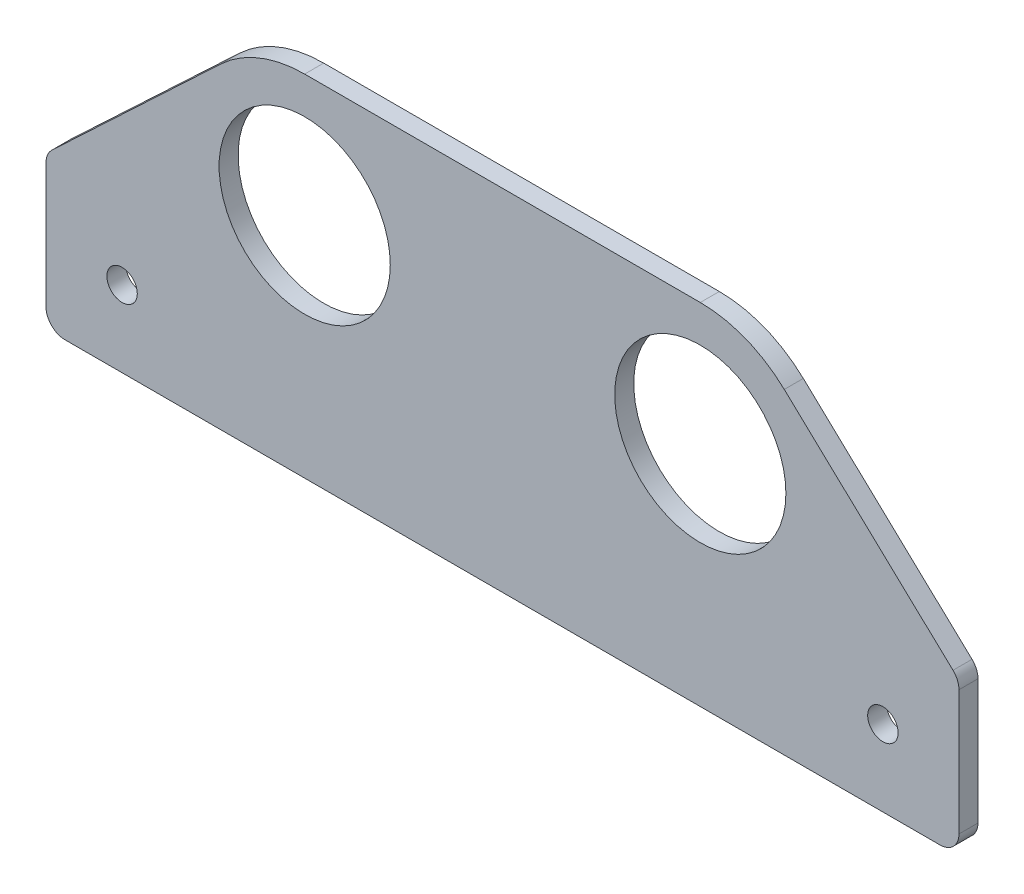
ISO-10303-21;
HEADER;
FILE_DESCRIPTION(('STEP AP214'),'2;1');
FILE_NAME('part.step','',(''),(''),'','','');
FILE_SCHEMA(('AUTOMOTIVE_DESIGN { 1 0 10303 214 1 1 1 1 }'));
ENDSEC;
DATA;
#1=APPLICATION_CONTEXT('core data for automotive mechanical design processes');
#2=APPLICATION_PROTOCOL_DEFINITION('international standard','automotive_design',2000,#1);
#3=PRODUCT_CONTEXT('',#1,'mechanical');
#4=PRODUCT('Part','Part','',(#3));
#5=PRODUCT_RELATED_PRODUCT_CATEGORY('part','',(#4));
#6=PRODUCT_DEFINITION_FORMATION('','',#4);
#7=PRODUCT_DEFINITION_CONTEXT('part definition',#1,'design');
#8=PRODUCT_DEFINITION('design','',#6,#7);
#9=PRODUCT_DEFINITION_SHAPE('','',#8);
#10=(LENGTH_UNIT() NAMED_UNIT(*) SI_UNIT(.MILLI.,.METRE.));
#11=(NAMED_UNIT(*) PLANE_ANGLE_UNIT() SI_UNIT($,.RADIAN.));
#12=(NAMED_UNIT(*) SI_UNIT($,.STERADIAN.) SOLID_ANGLE_UNIT());
#13=UNCERTAINTY_MEASURE_WITH_UNIT(LENGTH_MEASURE(1.E-05),#10,'distance_accuracy_value','');
#14=(GEOMETRIC_REPRESENTATION_CONTEXT(3) GLOBAL_UNCERTAINTY_ASSIGNED_CONTEXT((#13)) GLOBAL_UNIT_ASSIGNED_CONTEXT((#10,
#11,#12)) REPRESENTATION_CONTEXT('',''));
#15=CARTESIAN_POINT('',(0.,0.,0.));
#16=DIRECTION('',(0.,0.,1.));
#17=DIRECTION('',(1.,0.,0.));
#18=AXIS2_PLACEMENT_3D('',#15,#16,#17);
#19=CARTESIAN_POINT('',(43.18,37.973,3.175));
#20=DIRECTION('',(0.,0.,-1.));
#21=DIRECTION('',(-1.,0.,0.));
#22=AXIS2_PLACEMENT_3D('',#19,#20,#21);
#23=PLANE('',#22);
#24=DIRECTION('',(-0.728052653038429,-0.685521213678836,0.));
#25=VECTOR('',#24,1.);
#26=CARTESIAN_POINT('',(0.,25.4,3.175));
#27=LINE('',#26,#25);
#28=CARTESIAN_POINT('',(29.1631477439088,52.8594925966768,3.175));
#29=VERTEX_POINT('',#28);
#30=CARTESIAN_POINT('',(0.998470146569695,26.3401414359827,3.175));
#31=VERTEX_POINT('',#30);
#32=EDGE_CURVE('E155',#29,#31,#27,.T.);
#33=ORIENTED_EDGE('',*,*,#32,.T.);
#34=CARTESIAN_POINT('',(3.175,24.0285742625857,3.175));
#35=DIRECTION('',(0.,0.,-1.));
#36=DIRECTION('',(-1.,0.,0.));
#37=AXIS2_PLACEMENT_3D('',#34,#35,#36);
#38=CIRCLE('',#37,3.175);
#39=CARTESIAN_POINT('',(0.,24.0285742625857,3.175));
#40=VERTEX_POINT('',#39);
#41=EDGE_CURVE('E203',#31,#40,#38,.F.);
#42=ORIENTED_EDGE('',*,*,#41,.T.);
#43=DIRECTION('',(0.,-1.,0.));
#44=VECTOR('',#43,1.);
#45=CARTESIAN_POINT('',(0.,0.,3.175));
#46=LINE('',#45,#44);
#47=CARTESIAN_POINT('',(0.,3.175,3.175));
#48=VERTEX_POINT('',#47);
#49=EDGE_CURVE('E177',#40,#48,#46,.T.);
#50=ORIENTED_EDGE('',*,*,#49,.T.);
#51=CARTESIAN_POINT('',(3.175,3.175,3.175));
#52=DIRECTION('',(0.,0.,-1.));
#53=DIRECTION('',(-1.,0.,0.));
#54=AXIS2_PLACEMENT_3D('',#51,#52,#53);
#55=CIRCLE('',#54,3.175);
#56=CARTESIAN_POINT('',(3.175,0.,3.175));
#57=VERTEX_POINT('',#56);
#58=EDGE_CURVE('E199',#48,#57,#55,.F.);
#59=ORIENTED_EDGE('',*,*,#58,.T.);
#60=DIRECTION('',(1.,0.,0.));
#61=VECTOR('',#60,1.);
#62=CARTESIAN_POINT('',(0.,0.,3.175));
#63=LINE('',#62,#61);
#64=CARTESIAN_POINT('',(149.225,0.,3.175));
#65=VERTEX_POINT('',#64);
#66=EDGE_CURVE('E216',#57,#65,#63,.T.);
#67=ORIENTED_EDGE('',*,*,#66,.T.);
#68=CARTESIAN_POINT('',(149.225,3.175,3.175));
#69=DIRECTION('',(0.,0.,-1.));
#70=DIRECTION('',(-1.,0.,0.));
#71=AXIS2_PLACEMENT_3D('',#68,#69,#70);
#72=CIRCLE('',#71,3.175);
#73=CARTESIAN_POINT('',(152.4,3.175,3.175));
#74=VERTEX_POINT('',#73);
#75=EDGE_CURVE('E201',#65,#74,#72,.F.);
#76=ORIENTED_EDGE('',*,*,#75,.T.);
#77=DIRECTION('',(0.,1.,0.));
#78=VECTOR('',#77,1.);
#79=CARTESIAN_POINT('',(152.4,0.,3.175));
#80=LINE('',#79,#78);
#81=CARTESIAN_POINT('',(152.4,24.0285742625857,3.175));
#82=VERTEX_POINT('',#81);
#83=EDGE_CURVE('E133',#74,#82,#80,.T.);
#84=ORIENTED_EDGE('',*,*,#83,.T.);
#85=CARTESIAN_POINT('',(149.225,24.0285742625857,3.175));
#86=DIRECTION('',(0.,0.,-1.));
#87=DIRECTION('',(-1.,0.,0.));
#88=AXIS2_PLACEMENT_3D('',#85,#86,#87);
#89=CIRCLE('',#88,3.175);
#90=CARTESIAN_POINT('',(151.40152985343,26.3401414359827,3.175));
#91=VERTEX_POINT('',#90);
#92=EDGE_CURVE('E51',#82,#91,#89,.F.);
#93=ORIENTED_EDGE('',*,*,#92,.T.);
#94=DIRECTION('',(-0.728052653038429,0.685521213678836,0.));
#95=VECTOR('',#94,1.);
#96=CARTESIAN_POINT('',(152.4,25.4,3.175));
#97=LINE('',#96,#95);
#98=CARTESIAN_POINT('',(123.236852256091,52.8594925966767,3.175));
#99=VERTEX_POINT('',#98);
#100=EDGE_CURVE('E124',#91,#99,#97,.T.);
#101=ORIENTED_EDGE('',*,*,#100,.T.);
#102=CARTESIAN_POINT('',(109.22,37.973,3.175));
#103=DIRECTION('',(0.,0.,1.));
#104=DIRECTION('',(-1.,0.,0.));
#105=AXIS2_PLACEMENT_3D('',#102,#103,#104);
#106=CIRCLE('',#105,20.447);
#107=CARTESIAN_POINT('',(109.22,58.42,3.175));
#108=VERTEX_POINT('',#107);
#109=EDGE_CURVE('E129',#99,#108,#106,.T.);
#110=ORIENTED_EDGE('',*,*,#109,.T.);
#111=DIRECTION('',(-1.,0.,0.));
#112=VECTOR('',#111,1.);
#113=CARTESIAN_POINT('',(43.18,58.42,3.175));
#114=LINE('',#113,#112);
#115=CARTESIAN_POINT('',(43.18,58.42,3.175));
#116=VERTEX_POINT('',#115);
#117=EDGE_CURVE('E148',#108,#116,#114,.T.);
#118=ORIENTED_EDGE('',*,*,#117,.T.);
#119=CARTESIAN_POINT('',(43.18,37.973,3.175));
#120=DIRECTION('',(0.,0.,1.));
#121=DIRECTION('',(-1.,0.,0.));
#122=AXIS2_PLACEMENT_3D('',#119,#120,#121);
#123=CIRCLE('',#122,20.447);
#124=EDGE_CURVE('E150',#116,#29,#123,.T.);
#125=ORIENTED_EDGE('',*,*,#124,.T.);
#126=EDGE_LOOP('',(#33,#42,#50,#59,#67,#76,#84,#93,#101,#110,#118,#125));
#127=FACE_BOUND('',#126,.T.);
#128=CARTESIAN_POINT('',(109.22,37.973,3.175));
#129=DIRECTION('',(0.,0.,1.));
#130=DIRECTION('',(1.,0.,0.));
#131=AXIS2_PLACEMENT_3D('',#128,#129,#130);
#132=CIRCLE('',#131,14.2875);
#133=CARTESIAN_POINT('',(123.5075,37.973,3.175));
#134=VERTEX_POINT('',#133);
#135=EDGE_CURVE('E162',#134,#134,#132,.T.);
#136=ORIENTED_EDGE('',*,*,#135,.F.);
#137=EDGE_LOOP('',(#136));
#138=FACE_BOUND('',#137,.T.);
#139=CARTESIAN_POINT('',(43.18,37.973,3.175));
#140=DIRECTION('',(0.,0.,1.));
#141=DIRECTION('',(1.,0.,0.));
#142=AXIS2_PLACEMENT_3D('',#139,#140,#141);
#143=CIRCLE('',#142,14.2875);
#144=CARTESIAN_POINT('',(57.4675,37.973,3.175));
#145=VERTEX_POINT('',#144);
#146=EDGE_CURVE('E403',#145,#145,#143,.T.);
#147=ORIENTED_EDGE('',*,*,#146,.F.);
#148=EDGE_LOOP('',(#147));
#149=FACE_BOUND('',#148,.T.);
#150=CARTESIAN_POINT('',(12.7,12.7,3.175));
#151=DIRECTION('',(0.,0.,1.));
#152=DIRECTION('',(1.,0.,0.));
#153=AXIS2_PLACEMENT_3D('',#150,#151,#152);
#154=CIRCLE('',#153,2.54);
#155=CARTESIAN_POINT('',(15.24,12.7,3.175));
#156=VERTEX_POINT('',#155);
#157=EDGE_CURVE('E424',#156,#156,#154,.T.);
#158=ORIENTED_EDGE('',*,*,#157,.F.);
#159=EDGE_LOOP('',(#158));
#160=FACE_BOUND('',#159,.T.);
#161=CARTESIAN_POINT('',(139.7,12.7,3.175));
#162=DIRECTION('',(0.,0.,1.));
#163=DIRECTION('',(1.,0.,0.));
#164=AXIS2_PLACEMENT_3D('',#161,#162,#163);
#165=CIRCLE('',#164,2.54000000000001);
#166=CARTESIAN_POINT('',(142.24,12.7,3.175));
#167=VERTEX_POINT('',#166);
#168=EDGE_CURVE('E429',#167,#167,#165,.T.);
#169=ORIENTED_EDGE('',*,*,#168,.F.);
#170=EDGE_LOOP('',(#169));
#171=FACE_BOUND('',#170,.T.);
#172=ADVANCED_FACE('F36',(#127,#138,#149,#160,#171),#23,.F.);
#173=CARTESIAN_POINT('',(43.18,37.973,0.));
#174=DIRECTION('',(0.,0.,-1.));
#175=DIRECTION('',(-1.,0.,0.));
#176=AXIS2_PLACEMENT_3D('',#173,#174,#175);
#177=PLANE('',#176);
#178=CARTESIAN_POINT('',(12.7,12.7,0.));
#179=DIRECTION('',(0.,0.,1.));
#180=DIRECTION('',(1.,0.,0.));
#181=AXIS2_PLACEMENT_3D('',#178,#179,#180);
#182=CIRCLE('',#181,2.54);
#183=CARTESIAN_POINT('',(15.24,12.7,0.));
#184=VERTEX_POINT('',#183);
#185=EDGE_CURVE('E426',#184,#184,#182,.T.);
#186=ORIENTED_EDGE('',*,*,#185,.T.);
#187=EDGE_LOOP('',(#186));
#188=FACE_BOUND('',#187,.T.);
#189=CARTESIAN_POINT('',(109.22,37.973,0.));
#190=DIRECTION('',(0.,0.,1.));
#191=DIRECTION('',(1.,0.,0.));
#192=AXIS2_PLACEMENT_3D('',#189,#190,#191);
#193=CIRCLE('',#192,14.2875);
#194=CARTESIAN_POINT('',(123.5075,37.973,0.));
#195=VERTEX_POINT('',#194);
#196=EDGE_CURVE('E401',#195,#195,#193,.T.);
#197=ORIENTED_EDGE('',*,*,#196,.T.);
#198=EDGE_LOOP('',(#197));
#199=FACE_BOUND('',#198,.T.);
#200=DIRECTION('',(0.,-1.,0.));
#201=VECTOR('',#200,1.);
#202=CARTESIAN_POINT('',(0.,0.,0.));
#203=LINE('',#202,#201);
#204=CARTESIAN_POINT('',(0.,24.0285742625857,0.));
#205=VERTEX_POINT('',#204);
#206=CARTESIAN_POINT('',(0.,3.175,0.));
#207=VERTEX_POINT('',#206);
#208=EDGE_CURVE('E158',#205,#207,#203,.T.);
#209=ORIENTED_EDGE('',*,*,#208,.F.);
#210=CARTESIAN_POINT('',(3.175,24.0285742625857,0.));
#211=DIRECTION('',(0.,0.,-1.));
#212=DIRECTION('',(-1.,0.,0.));
#213=AXIS2_PLACEMENT_3D('',#210,#211,#212);
#214=CIRCLE('',#213,3.175);
#215=CARTESIAN_POINT('',(0.998470146569695,26.3401414359827,0.));
#216=VERTEX_POINT('',#215);
#217=EDGE_CURVE('E194',#205,#216,#214,.T.);
#218=ORIENTED_EDGE('',*,*,#217,.T.);
#219=DIRECTION('',(-0.728052653038429,-0.685521213678836,0.));
#220=VECTOR('',#219,1.);
#221=CARTESIAN_POINT('',(0.,25.4,0.));
#222=LINE('',#221,#220);
#223=CARTESIAN_POINT('',(29.1631477439088,52.8594925966768,0.));
#224=VERTEX_POINT('',#223);
#225=EDGE_CURVE('E174',#224,#216,#222,.T.);
#226=ORIENTED_EDGE('',*,*,#225,.F.);
#227=CARTESIAN_POINT('',(43.18,37.973,0.));
#228=DIRECTION('',(0.,0.,1.));
#229=DIRECTION('',(-1.,0.,0.));
#230=AXIS2_PLACEMENT_3D('',#227,#228,#229);
#231=CIRCLE('',#230,20.447);
#232=CARTESIAN_POINT('',(43.18,58.42,0.));
#233=VERTEX_POINT('',#232);
#234=EDGE_CURVE('E172',#233,#224,#231,.T.);
#235=ORIENTED_EDGE('',*,*,#234,.F.);
#236=DIRECTION('',(-1.,0.,0.));
#237=VECTOR('',#236,1.);
#238=CARTESIAN_POINT('',(43.18,58.42,0.));
#239=LINE('',#238,#237);
#240=CARTESIAN_POINT('',(109.22,58.42,0.));
#241=VERTEX_POINT('',#240);
#242=EDGE_CURVE('E170',#241,#233,#239,.T.);
#243=ORIENTED_EDGE('',*,*,#242,.F.);
#244=CARTESIAN_POINT('',(109.22,37.973,0.));
#245=DIRECTION('',(0.,0.,1.));
#246=DIRECTION('',(-1.,0.,0.));
#247=AXIS2_PLACEMENT_3D('',#244,#245,#246);
#248=CIRCLE('',#247,20.447);
#249=CARTESIAN_POINT('',(123.236852256091,52.8594925966767,0.));
#250=VERTEX_POINT('',#249);
#251=EDGE_CURVE('E168',#250,#241,#248,.T.);
#252=ORIENTED_EDGE('',*,*,#251,.F.);
#253=DIRECTION('',(-0.728052653038429,0.685521213678836,0.));
#254=VECTOR('',#253,1.);
#255=CARTESIAN_POINT('',(152.4,25.4,0.));
#256=LINE('',#255,#254);
#257=CARTESIAN_POINT('',(151.40152985343,26.3401414359827,0.));
#258=VERTEX_POINT('',#257);
#259=EDGE_CURVE('E139',#258,#250,#256,.T.);
#260=ORIENTED_EDGE('',*,*,#259,.F.);
#261=CARTESIAN_POINT('',(149.225,24.0285742625857,0.));
#262=DIRECTION('',(0.,0.,-1.));
#263=DIRECTION('',(-1.,0.,0.));
#264=AXIS2_PLACEMENT_3D('',#261,#262,#263);
#265=CIRCLE('',#264,3.175);
#266=CARTESIAN_POINT('',(152.4,24.0285742625857,0.));
#267=VERTEX_POINT('',#266);
#268=EDGE_CURVE('E188',#258,#267,#265,.T.);
#269=ORIENTED_EDGE('',*,*,#268,.T.);
#270=DIRECTION('',(0.,1.,0.));
#271=VECTOR('',#270,1.);
#272=CARTESIAN_POINT('',(152.4,0.,0.));
#273=LINE('',#272,#271);
#274=CARTESIAN_POINT('',(152.4,3.175,0.));
#275=VERTEX_POINT('',#274);
#276=EDGE_CURVE('E165',#275,#267,#273,.T.);
#277=ORIENTED_EDGE('',*,*,#276,.F.);
#278=CARTESIAN_POINT('',(149.225,3.175,0.));
#279=DIRECTION('',(0.,0.,-1.));
#280=DIRECTION('',(-1.,0.,0.));
#281=AXIS2_PLACEMENT_3D('',#278,#279,#280);
#282=CIRCLE('',#281,3.175);
#283=CARTESIAN_POINT('',(149.225,0.,0.));
#284=VERTEX_POINT('',#283);
#285=EDGE_CURVE('E192',#275,#284,#282,.T.);
#286=ORIENTED_EDGE('',*,*,#285,.T.);
#287=DIRECTION('',(1.,0.,0.));
#288=VECTOR('',#287,1.);
#289=CARTESIAN_POINT('',(0.,0.,0.));
#290=LINE('',#289,#288);
#291=CARTESIAN_POINT('',(3.175,0.,0.));
#292=VERTEX_POINT('',#291);
#293=EDGE_CURVE('E161',#292,#284,#290,.T.);
#294=ORIENTED_EDGE('',*,*,#293,.F.);
#295=CARTESIAN_POINT('',(3.175,3.175,0.));
#296=DIRECTION('',(0.,0.,-1.));
#297=DIRECTION('',(-1.,0.,0.));
#298=AXIS2_PLACEMENT_3D('',#295,#296,#297);
#299=CIRCLE('',#298,3.175);
#300=EDGE_CURVE('E190',#292,#207,#299,.T.);
#301=ORIENTED_EDGE('',*,*,#300,.T.);
#302=EDGE_LOOP('',(#209,#218,#226,#235,#243,#252,#260,#269,#277,#286,#294,#301));
#303=FACE_BOUND('',#302,.T.);
#304=CARTESIAN_POINT('',(43.18,37.973,0.));
#305=DIRECTION('',(0.,0.,1.));
#306=DIRECTION('',(1.,0.,0.));
#307=AXIS2_PLACEMENT_3D('',#304,#305,#306);
#308=CIRCLE('',#307,14.2875);
#309=CARTESIAN_POINT('',(57.4675,37.973,0.));
#310=VERTEX_POINT('',#309);
#311=EDGE_CURVE('E407',#310,#310,#308,.T.);
#312=ORIENTED_EDGE('',*,*,#311,.T.);
#313=EDGE_LOOP('',(#312));
#314=FACE_BOUND('',#313,.T.);
#315=CARTESIAN_POINT('',(139.7,12.7,0.));
#316=DIRECTION('',(0.,0.,1.));
#317=DIRECTION('',(1.,0.,0.));
#318=AXIS2_PLACEMENT_3D('',#315,#316,#317);
#319=CIRCLE('',#318,2.54000000000001);
#320=CARTESIAN_POINT('',(142.24,12.7,0.));
#321=VERTEX_POINT('',#320);
#322=EDGE_CURVE('E432',#321,#321,#319,.T.);
#323=ORIENTED_EDGE('',*,*,#322,.T.);
#324=EDGE_LOOP('',(#323));
#325=FACE_BOUND('',#324,.T.);
#326=ADVANCED_FACE('F230',(#188,#199,#303,#314,#325),#177,.T.);
#327=CARTESIAN_POINT('',(0.,0.,3.175));
#328=DIRECTION('',(1.,0.,0.));
#329=DIRECTION('',(0.,0.,-1.));
#330=AXIS2_PLACEMENT_3D('',#327,#328,#329);
#331=PLANE('',#330);
#332=ORIENTED_EDGE('',*,*,#49,.F.);
#333=DIRECTION('',(0.,0.,-1.));
#334=VECTOR('',#333,1.);
#335=CARTESIAN_POINT('',(0.,24.0285742625857,3.175));
#336=LINE('',#335,#334);
#337=EDGE_CURVE('E185',#40,#205,#336,.T.);
#338=ORIENTED_EDGE('',*,*,#337,.T.);
#339=ORIENTED_EDGE('',*,*,#208,.T.);
#340=DIRECTION('',(0.,0.,-1.));
#341=VECTOR('',#340,1.);
#342=CARTESIAN_POINT('',(0.,3.175,3.175));
#343=LINE('',#342,#341);
#344=EDGE_CURVE('E142',#207,#48,#343,.F.);
#345=ORIENTED_EDGE('',*,*,#344,.T.);
#346=EDGE_LOOP('',(#332,#338,#339,#345));
#347=FACE_BOUND('',#346,.T.);
#348=ADVANCED_FACE('F244',(#347),#331,.F.);
#349=CARTESIAN_POINT('',(0.,0.,3.175));
#350=DIRECTION('',(0.,1.,0.));
#351=DIRECTION('',(0.,0.,1.));
#352=AXIS2_PLACEMENT_3D('',#349,#350,#351);
#353=PLANE('',#352);
#354=ORIENTED_EDGE('',*,*,#293,.T.);
#355=DIRECTION('',(0.,0.,-1.));
#356=VECTOR('',#355,1.);
#357=CARTESIAN_POINT('',(149.225,0.,3.175));
#358=LINE('',#357,#356);
#359=EDGE_CURVE('E44',#284,#65,#358,.F.);
#360=ORIENTED_EDGE('',*,*,#359,.T.);
#361=ORIENTED_EDGE('',*,*,#66,.F.);
#362=DIRECTION('',(0.,0.,-1.));
#363=VECTOR('',#362,1.);
#364=CARTESIAN_POINT('',(3.175,0.,3.175));
#365=LINE('',#364,#363);
#366=EDGE_CURVE('E209',#57,#292,#365,.T.);
#367=ORIENTED_EDGE('',*,*,#366,.T.);
#368=EDGE_LOOP('',(#354,#360,#361,#367));
#369=FACE_BOUND('',#368,.T.);
#370=ADVANCED_FACE('F215',(#369),#353,.F.);
#371=CARTESIAN_POINT('',(152.4,0.,3.175));
#372=DIRECTION('',(-1.,0.,0.));
#373=DIRECTION('',(0.,0.,1.));
#374=AXIS2_PLACEMENT_3D('',#371,#372,#373);
#375=PLANE('',#374);
#376=ORIENTED_EDGE('',*,*,#83,.F.);
#377=DIRECTION('',(0.,0.,-1.));
#378=VECTOR('',#377,1.);
#379=CARTESIAN_POINT('',(152.4,3.175,3.175));
#380=LINE('',#379,#378);
#381=EDGE_CURVE('E206',#74,#275,#380,.T.);
#382=ORIENTED_EDGE('',*,*,#381,.T.);
#383=ORIENTED_EDGE('',*,*,#276,.T.);
#384=DIRECTION('',(0.,0.,-1.));
#385=VECTOR('',#384,1.);
#386=CARTESIAN_POINT('',(152.4,24.0285742625857,3.175));
#387=LINE('',#386,#385);
#388=EDGE_CURVE('E59',#267,#82,#387,.F.);
#389=ORIENTED_EDGE('',*,*,#388,.T.);
#390=EDGE_LOOP('',(#376,#382,#383,#389));
#391=FACE_BOUND('',#390,.T.);
#392=ADVANCED_FACE('F227',(#391),#375,.F.);
#393=CARTESIAN_POINT('',(152.4,25.4,3.175));
#394=DIRECTION('',(-0.685521213678836,-0.728052653038429,0.));
#395=DIRECTION('',(0.728052653038429,-0.685521213678836,0.));
#396=AXIS2_PLACEMENT_3D('',#393,#394,#395);
#397=PLANE('',#396);
#398=ORIENTED_EDGE('',*,*,#100,.F.);
#399=DIRECTION('',(0.,0.,-1.));
#400=VECTOR('',#399,1.);
#401=CARTESIAN_POINT('',(151.40152985343,26.3401414359827,3.175));
#402=LINE('',#401,#400);
#403=EDGE_CURVE('E11',#91,#258,#402,.T.);
#404=ORIENTED_EDGE('',*,*,#403,.T.);
#405=ORIENTED_EDGE('',*,*,#259,.T.);
#406=DIRECTION('',(0.,0.,-1.));
#407=VECTOR('',#406,1.);
#408=CARTESIAN_POINT('',(123.236852256091,52.8594925966767,3.175));
#409=LINE('',#408,#407);
#410=EDGE_CURVE('E136',#99,#250,#409,.T.);
#411=ORIENTED_EDGE('',*,*,#410,.F.);
#412=EDGE_LOOP('',(#398,#404,#405,#411));
#413=FACE_BOUND('',#412,.T.);
#414=ADVANCED_FACE('F137',(#413),#397,.F.);
#415=CARTESIAN_POINT('',(109.22,37.973,3.175));
#416=DIRECTION('',(0.,0.,-1.));
#417=DIRECTION('',(-1.,0.,0.));
#418=AXIS2_PLACEMENT_3D('',#415,#416,#417);
#419=CYLINDRICAL_SURFACE('',#418,20.447);
#420=ORIENTED_EDGE('',*,*,#251,.T.);
#421=DIRECTION('',(0.,0.,-1.));
#422=VECTOR('',#421,1.);
#423=CARTESIAN_POINT('',(109.22,58.42,3.175));
#424=LINE('',#423,#422);
#425=EDGE_CURVE('E143',#108,#241,#424,.T.);
#426=ORIENTED_EDGE('',*,*,#425,.F.);
#427=ORIENTED_EDGE('',*,*,#109,.F.);
#428=ORIENTED_EDGE('',*,*,#410,.T.);
#429=EDGE_LOOP('',(#420,#426,#427,#428));
#430=FACE_BOUND('',#429,.T.);
#431=ADVANCED_FACE('F145',(#430),#419,.T.);
#432=CARTESIAN_POINT('',(43.18,58.42,3.175));
#433=DIRECTION('',(0.,-1.,0.));
#434=DIRECTION('',(0.,0.,-1.));
#435=AXIS2_PLACEMENT_3D('',#432,#433,#434);
#436=PLANE('',#435);
#437=ORIENTED_EDGE('',*,*,#242,.T.);
#438=DIRECTION('',(0.,0.,-1.));
#439=VECTOR('',#438,1.);
#440=CARTESIAN_POINT('',(43.18,58.42,3.175));
#441=LINE('',#440,#439);
#442=EDGE_CURVE('E180',#116,#233,#441,.T.);
#443=ORIENTED_EDGE('',*,*,#442,.F.);
#444=ORIENTED_EDGE('',*,*,#117,.F.);
#445=ORIENTED_EDGE('',*,*,#425,.T.);
#446=EDGE_LOOP('',(#437,#443,#444,#445));
#447=FACE_BOUND('',#446,.T.);
#448=ADVANCED_FACE('F258',(#447),#436,.F.);
#449=CARTESIAN_POINT('',(43.18,37.973,3.175));
#450=DIRECTION('',(0.,0.,-1.));
#451=DIRECTION('',(-1.,0.,0.));
#452=AXIS2_PLACEMENT_3D('',#449,#450,#451);
#453=CYLINDRICAL_SURFACE('',#452,20.447);
#454=ORIENTED_EDGE('',*,*,#234,.T.);
#455=DIRECTION('',(0.,0.,-1.));
#456=VECTOR('',#455,1.);
#457=CARTESIAN_POINT('',(29.1631477439088,52.8594925966768,3.175));
#458=LINE('',#457,#456);
#459=EDGE_CURVE('E157',#29,#224,#458,.T.);
#460=ORIENTED_EDGE('',*,*,#459,.F.);
#461=ORIENTED_EDGE('',*,*,#124,.F.);
#462=ORIENTED_EDGE('',*,*,#442,.T.);
#463=EDGE_LOOP('',(#454,#460,#461,#462));
#464=FACE_BOUND('',#463,.T.);
#465=ADVANCED_FACE('F254',(#464),#453,.T.);
#466=CARTESIAN_POINT('',(0.,25.4,3.175));
#467=DIRECTION('',(0.685521213678836,-0.728052653038429,0.));
#468=DIRECTION('',(0.728052653038429,0.685521213678836,0.));
#469=AXIS2_PLACEMENT_3D('',#466,#467,#468);
#470=PLANE('',#469);
#471=ORIENTED_EDGE('',*,*,#225,.T.);
#472=DIRECTION('',(0.,0.,-1.));
#473=VECTOR('',#472,1.);
#474=CARTESIAN_POINT('',(0.998470146569695,26.3401414359827,3.175));
#475=LINE('',#474,#473);
#476=EDGE_CURVE('E196',#216,#31,#475,.F.);
#477=ORIENTED_EDGE('',*,*,#476,.T.);
#478=ORIENTED_EDGE('',*,*,#32,.F.);
#479=ORIENTED_EDGE('',*,*,#459,.T.);
#480=EDGE_LOOP('',(#471,#477,#478,#479));
#481=FACE_BOUND('',#480,.T.);
#482=ADVANCED_FACE('F251',(#481),#470,.F.);
#483=CARTESIAN_POINT('',(109.22,37.973,3.175));
#484=DIRECTION('',(0.,0.,-1.));
#485=DIRECTION('',(-1.,0.,0.));
#486=AXIS2_PLACEMENT_3D('',#483,#484,#485);
#487=CYLINDRICAL_SURFACE('',#486,14.2875);
#488=ORIENTED_EDGE('',*,*,#135,.T.);
#489=EDGE_LOOP('',(#488));
#490=FACE_BOUND('',#489,.T.);
#491=ORIENTED_EDGE('',*,*,#196,.F.);
#492=EDGE_LOOP('',(#491));
#493=FACE_BOUND('',#492,.T.);
#494=ADVANCED_FACE('F248',(#490,#493),#487,.F.);
#495=CARTESIAN_POINT('',(43.18,37.973,3.175));
#496=DIRECTION('',(0.,0.,-1.));
#497=DIRECTION('',(-1.,0.,0.));
#498=AXIS2_PLACEMENT_3D('',#495,#496,#497);
#499=CYLINDRICAL_SURFACE('',#498,14.2875);
#500=ORIENTED_EDGE('',*,*,#146,.T.);
#501=EDGE_LOOP('',(#500));
#502=FACE_BOUND('',#501,.T.);
#503=ORIENTED_EDGE('',*,*,#311,.F.);
#504=EDGE_LOOP('',(#503));
#505=FACE_BOUND('',#504,.T.);
#506=ADVANCED_FACE('F318',(#502,#505),#499,.F.);
#507=CARTESIAN_POINT('',(12.7,12.7,3.175));
#508=DIRECTION('',(0.,0.,-1.));
#509=DIRECTION('',(-1.,0.,0.));
#510=AXIS2_PLACEMENT_3D('',#507,#508,#509);
#511=CYLINDRICAL_SURFACE('',#510,2.54);
#512=ORIENTED_EDGE('',*,*,#157,.T.);
#513=EDGE_LOOP('',(#512));
#514=FACE_BOUND('',#513,.T.);
#515=ORIENTED_EDGE('',*,*,#185,.F.);
#516=EDGE_LOOP('',(#515));
#517=FACE_BOUND('',#516,.T.);
#518=ADVANCED_FACE('F309',(#514,#517),#511,.F.);
#519=CARTESIAN_POINT('',(139.7,12.7,3.175));
#520=DIRECTION('',(0.,0.,-1.));
#521=DIRECTION('',(-1.,0.,0.));
#522=AXIS2_PLACEMENT_3D('',#519,#520,#521);
#523=CYLINDRICAL_SURFACE('',#522,2.54000000000001);
#524=ORIENTED_EDGE('',*,*,#168,.T.);
#525=EDGE_LOOP('',(#524));
#526=FACE_BOUND('',#525,.T.);
#527=ORIENTED_EDGE('',*,*,#322,.F.);
#528=EDGE_LOOP('',(#527));
#529=FACE_BOUND('',#528,.T.);
#530=ADVANCED_FACE('F277',(#526,#529),#523,.F.);
#531=CARTESIAN_POINT('',(3.175,24.0285742625857,3.175));
#532=DIRECTION('',(0.,0.,-1.));
#533=DIRECTION('',(-1.,0.,0.));
#534=AXIS2_PLACEMENT_3D('',#531,#532,#533);
#535=CYLINDRICAL_SURFACE('',#534,3.175);
#536=ORIENTED_EDGE('',*,*,#41,.F.);
#537=ORIENTED_EDGE('',*,*,#476,.F.);
#538=ORIENTED_EDGE('',*,*,#217,.F.);
#539=ORIENTED_EDGE('',*,*,#337,.F.);
#540=EDGE_LOOP('',(#536,#537,#538,#539));
#541=FACE_BOUND('',#540,.T.);
#542=ADVANCED_FACE('F274',(#541),#535,.T.);
#543=CARTESIAN_POINT('',(149.225,3.175,3.175));
#544=DIRECTION('',(0.,0.,-1.));
#545=DIRECTION('',(-1.,0.,0.));
#546=AXIS2_PLACEMENT_3D('',#543,#544,#545);
#547=CYLINDRICAL_SURFACE('',#546,3.175);
#548=ORIENTED_EDGE('',*,*,#75,.F.);
#549=ORIENTED_EDGE('',*,*,#359,.F.);
#550=ORIENTED_EDGE('',*,*,#285,.F.);
#551=ORIENTED_EDGE('',*,*,#381,.F.);
#552=EDGE_LOOP('',(#548,#549,#550,#551));
#553=FACE_BOUND('',#552,.T.);
#554=ADVANCED_FACE('F225',(#553),#547,.T.);
#555=CARTESIAN_POINT('',(3.175,3.175,3.175));
#556=DIRECTION('',(0.,0.,-1.));
#557=DIRECTION('',(-1.,0.,0.));
#558=AXIS2_PLACEMENT_3D('',#555,#556,#557);
#559=CYLINDRICAL_SURFACE('',#558,3.175);
#560=ORIENTED_EDGE('',*,*,#58,.F.);
#561=ORIENTED_EDGE('',*,*,#344,.F.);
#562=ORIENTED_EDGE('',*,*,#300,.F.);
#563=ORIENTED_EDGE('',*,*,#366,.F.);
#564=EDGE_LOOP('',(#560,#561,#562,#563));
#565=FACE_BOUND('',#564,.T.);
#566=ADVANCED_FACE('F234',(#565),#559,.T.);
#567=CARTESIAN_POINT('',(149.225,24.0285742625857,3.175));
#568=DIRECTION('',(0.,0.,-1.));
#569=DIRECTION('',(-1.,0.,0.));
#570=AXIS2_PLACEMENT_3D('',#567,#568,#569);
#571=CYLINDRICAL_SURFACE('',#570,3.175);
#572=ORIENTED_EDGE('',*,*,#92,.F.);
#573=ORIENTED_EDGE('',*,*,#388,.F.);
#574=ORIENTED_EDGE('',*,*,#268,.F.);
#575=ORIENTED_EDGE('',*,*,#403,.F.);
#576=EDGE_LOOP('',(#572,#573,#574,#575));
#577=FACE_BOUND('',#576,.T.);
#578=ADVANCED_FACE('F38',(#577),#571,.T.);
#579=CLOSED_SHELL('',(#172,#326,#348,#370,#392,#414,#431,#448,#465,#482,#494,#506,#518,#530,
#542,#554,#566,#578));
#580=MANIFOLD_SOLID_BREP('B2',#579);
#581=ADVANCED_BREP_SHAPE_REPRESENTATION('',(#18,#580),#14);
#582=SHAPE_DEFINITION_REPRESENTATION(#9,#581);
ENDSEC;
END-ISO-10303-21;
